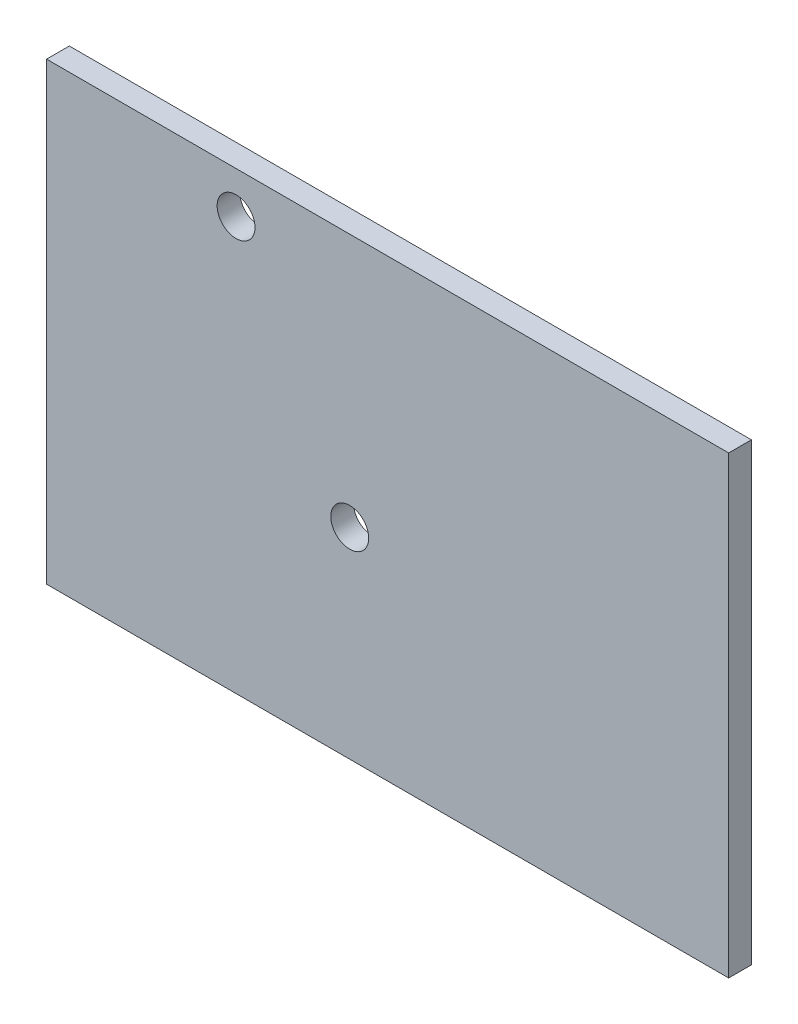
ISO-10303-21;
HEADER;
FILE_DESCRIPTION(('STEP AP214'),'2;1');
FILE_NAME('part.step','',(''),(''),'','','');
FILE_SCHEMA(('AUTOMOTIVE_DESIGN { 1 0 10303 214 1 1 1 1 }'));
ENDSEC;
DATA;
#1=APPLICATION_CONTEXT('core data for automotive mechanical design processes');
#2=APPLICATION_PROTOCOL_DEFINITION('international standard','automotive_design',2000,#1);
#3=PRODUCT_CONTEXT('',#1,'mechanical');
#4=PRODUCT('Part','Part','',(#3));
#5=PRODUCT_RELATED_PRODUCT_CATEGORY('part','',(#4));
#6=PRODUCT_DEFINITION_FORMATION('','',#4);
#7=PRODUCT_DEFINITION_CONTEXT('part definition',#1,'design');
#8=PRODUCT_DEFINITION('design','',#6,#7);
#9=PRODUCT_DEFINITION_SHAPE('','',#8);
#10=(LENGTH_UNIT() NAMED_UNIT(*) SI_UNIT(.MILLI.,.METRE.));
#11=(NAMED_UNIT(*) PLANE_ANGLE_UNIT() SI_UNIT($,.RADIAN.));
#12=(NAMED_UNIT(*) SI_UNIT($,.STERADIAN.) SOLID_ANGLE_UNIT());
#13=UNCERTAINTY_MEASURE_WITH_UNIT(LENGTH_MEASURE(1.E-05),#10,'distance_accuracy_value','');
#14=(GEOMETRIC_REPRESENTATION_CONTEXT(3) GLOBAL_UNCERTAINTY_ASSIGNED_CONTEXT((#13)) GLOBAL_UNIT_ASSIGNED_CONTEXT((#10,
#11,#12)) REPRESENTATION_CONTEXT('',''));
#15=CARTESIAN_POINT('',(0.,0.,0.));
#16=DIRECTION('',(0.,0.,1.));
#17=DIRECTION('',(1.,0.,0.));
#18=AXIS2_PLACEMENT_3D('',#15,#16,#17);
#19=CARTESIAN_POINT('',(0.,0.,3.));
#20=DIRECTION('',(0.,0.,1.));
#21=DIRECTION('',(1.,0.,0.));
#22=AXIS2_PLACEMENT_3D('',#19,#20,#21);
#23=PLANE('',#22);
#24=CARTESIAN_POINT('',(-20.,24.5,3.));
#25=DIRECTION('',(0.,0.,1.));
#26=DIRECTION('',(1.,0.,0.));
#27=AXIS2_PLACEMENT_3D('',#24,#25,#26);
#28=CIRCLE('',#27,2.5);
#29=CARTESIAN_POINT('',(-17.5,24.5,3.));
#30=VERTEX_POINT('',#29);
#31=EDGE_CURVE('E100',#30,#30,#28,.T.);
#32=ORIENTED_EDGE('',*,*,#31,.F.);
#33=EDGE_LOOP('',(#32));
#34=FACE_BOUND('',#33,.T.);
#35=DIRECTION('',(0.,1.,0.));
#36=VECTOR('',#35,1.);
#37=CARTESIAN_POINT('',(45.,30.,3.));
#38=LINE('',#37,#36);
#39=CARTESIAN_POINT('',(45.,-30.,3.));
#40=VERTEX_POINT('',#39);
#41=CARTESIAN_POINT('',(45.,30.,3.));
#42=VERTEX_POINT('',#41);
#43=EDGE_CURVE('E85',#40,#42,#38,.T.);
#44=ORIENTED_EDGE('',*,*,#43,.T.);
#45=DIRECTION('',(-1.,0.,0.));
#46=VECTOR('',#45,1.);
#47=CARTESIAN_POINT('',(-45.,30.,3.));
#48=LINE('',#47,#46);
#49=CARTESIAN_POINT('',(-45.,30.,3.));
#50=VERTEX_POINT('',#49);
#51=EDGE_CURVE('E80',#42,#50,#48,.T.);
#52=ORIENTED_EDGE('',*,*,#51,.T.);
#53=DIRECTION('',(0.,-1.,0.));
#54=VECTOR('',#53,1.);
#55=CARTESIAN_POINT('',(-45.,30.,3.));
#56=LINE('',#55,#54);
#57=CARTESIAN_POINT('',(-45.,-30.,3.));
#58=VERTEX_POINT('',#57);
#59=EDGE_CURVE('E83',#50,#58,#56,.T.);
#60=ORIENTED_EDGE('',*,*,#59,.T.);
#61=DIRECTION('',(1.,0.,0.));
#62=VECTOR('',#61,1.);
#63=CARTESIAN_POINT('',(-45.,-30.,3.));
#64=LINE('',#63,#62);
#65=EDGE_CURVE('E50',#58,#40,#64,.T.);
#66=ORIENTED_EDGE('',*,*,#65,.T.);
#67=EDGE_LOOP('',(#44,#52,#60,#66));
#68=FACE_BOUND('',#67,.T.);
#69=CARTESIAN_POINT('',(-5.,-3.50000000000001,3.));
#70=DIRECTION('',(0.,0.,1.));
#71=DIRECTION('',(1.,0.,0.));
#72=AXIS2_PLACEMENT_3D('',#69,#70,#71);
#73=CIRCLE('',#72,2.5);
#74=CARTESIAN_POINT('',(-2.5,-3.50000000000001,3.));
#75=VERTEX_POINT('',#74);
#76=EDGE_CURVE('E115',#75,#75,#73,.T.);
#77=ORIENTED_EDGE('',*,*,#76,.F.);
#78=EDGE_LOOP('',(#77));
#79=FACE_BOUND('',#78,.T.);
#80=ADVANCED_FACE('F33',(#34,#68,#79),#23,.T.);
#81=CARTESIAN_POINT('',(0.,0.,0.));
#82=DIRECTION('',(0.,0.,1.));
#83=DIRECTION('',(1.,0.,0.));
#84=AXIS2_PLACEMENT_3D('',#81,#82,#83);
#85=PLANE('',#84);
#86=DIRECTION('',(0.,1.,0.));
#87=VECTOR('',#86,1.);
#88=CARTESIAN_POINT('',(45.,30.,0.));
#89=LINE('',#88,#87);
#90=CARTESIAN_POINT('',(45.,-30.,0.));
#91=VERTEX_POINT('',#90);
#92=CARTESIAN_POINT('',(45.,30.,0.));
#93=VERTEX_POINT('',#92);
#94=EDGE_CURVE('E97',#91,#93,#89,.T.);
#95=ORIENTED_EDGE('',*,*,#94,.F.);
#96=DIRECTION('',(1.,0.,0.));
#97=VECTOR('',#96,1.);
#98=CARTESIAN_POINT('',(-45.,-30.,0.));
#99=LINE('',#98,#97);
#100=CARTESIAN_POINT('',(-45.,-30.,0.));
#101=VERTEX_POINT('',#100);
#102=EDGE_CURVE('E73',#101,#91,#99,.T.);
#103=ORIENTED_EDGE('',*,*,#102,.F.);
#104=DIRECTION('',(0.,-1.,0.));
#105=VECTOR('',#104,1.);
#106=CARTESIAN_POINT('',(-45.,30.,0.));
#107=LINE('',#106,#105);
#108=CARTESIAN_POINT('',(-45.,30.,0.));
#109=VERTEX_POINT('',#108);
#110=EDGE_CURVE('E67',#109,#101,#107,.T.);
#111=ORIENTED_EDGE('',*,*,#110,.F.);
#112=DIRECTION('',(-1.,0.,0.));
#113=VECTOR('',#112,1.);
#114=CARTESIAN_POINT('',(-45.,30.,0.));
#115=LINE('',#114,#113);
#116=EDGE_CURVE('E89',#93,#109,#115,.T.);
#117=ORIENTED_EDGE('',*,*,#116,.F.);
#118=EDGE_LOOP('',(#95,#103,#111,#117));
#119=FACE_BOUND('',#118,.T.);
#120=CARTESIAN_POINT('',(-20.,24.5,0.));
#121=DIRECTION('',(0.,0.,1.));
#122=DIRECTION('',(1.,0.,0.));
#123=AXIS2_PLACEMENT_3D('',#120,#121,#122);
#124=CIRCLE('',#123,2.5);
#125=CARTESIAN_POINT('',(-17.5,24.5,0.));
#126=VERTEX_POINT('',#125);
#127=EDGE_CURVE('E112',#126,#126,#124,.T.);
#128=ORIENTED_EDGE('',*,*,#127,.T.);
#129=EDGE_LOOP('',(#128));
#130=FACE_BOUND('',#129,.T.);
#131=CARTESIAN_POINT('',(-5.,-3.50000000000001,0.));
#132=DIRECTION('',(0.,0.,1.));
#133=DIRECTION('',(1.,0.,0.));
#134=AXIS2_PLACEMENT_3D('',#131,#132,#133);
#135=CIRCLE('',#134,2.5);
#136=CARTESIAN_POINT('',(-2.5,-3.50000000000001,0.));
#137=VERTEX_POINT('',#136);
#138=EDGE_CURVE('E118',#137,#137,#135,.T.);
#139=ORIENTED_EDGE('',*,*,#138,.T.);
#140=EDGE_LOOP('',(#139));
#141=FACE_BOUND('',#140,.T.);
#142=ADVANCED_FACE('F108',(#119,#130,#141),#85,.F.);
#143=CARTESIAN_POINT('',(45.,30.,3.));
#144=DIRECTION('',(-1.,0.,0.));
#145=DIRECTION('',(0.,0.,1.));
#146=AXIS2_PLACEMENT_3D('',#143,#144,#145);
#147=PLANE('',#146);
#148=ORIENTED_EDGE('',*,*,#94,.T.);
#149=DIRECTION('',(0.,0.,-1.));
#150=VECTOR('',#149,1.);
#151=CARTESIAN_POINT('',(45.,30.,3.));
#152=LINE('',#151,#150);
#153=EDGE_CURVE('E11',#42,#93,#152,.T.);
#154=ORIENTED_EDGE('',*,*,#153,.F.);
#155=ORIENTED_EDGE('',*,*,#43,.F.);
#156=DIRECTION('',(0.,0.,-1.));
#157=VECTOR('',#156,1.);
#158=CARTESIAN_POINT('',(45.,-30.,3.));
#159=LINE('',#158,#157);
#160=EDGE_CURVE('E93',#40,#91,#159,.T.);
#161=ORIENTED_EDGE('',*,*,#160,.T.);
#162=EDGE_LOOP('',(#148,#154,#155,#161));
#163=FACE_BOUND('',#162,.T.);
#164=ADVANCED_FACE('F35',(#163),#147,.F.);
#165=CARTESIAN_POINT('',(-45.,30.,3.));
#166=DIRECTION('',(0.,-1.,0.));
#167=DIRECTION('',(0.,0.,-1.));
#168=AXIS2_PLACEMENT_3D('',#165,#166,#167);
#169=PLANE('',#168);
#170=ORIENTED_EDGE('',*,*,#116,.T.);
#171=DIRECTION('',(0.,0.,-1.));
#172=VECTOR('',#171,1.);
#173=CARTESIAN_POINT('',(-45.,30.,3.));
#174=LINE('',#173,#172);
#175=EDGE_CURVE('E42',#50,#109,#174,.T.);
#176=ORIENTED_EDGE('',*,*,#175,.F.);
#177=ORIENTED_EDGE('',*,*,#51,.F.);
#178=ORIENTED_EDGE('',*,*,#153,.T.);
#179=EDGE_LOOP('',(#170,#176,#177,#178));
#180=FACE_BOUND('',#179,.T.);
#181=ADVANCED_FACE('F88',(#180),#169,.F.);
#182=CARTESIAN_POINT('',(-45.,30.,3.));
#183=DIRECTION('',(1.,0.,0.));
#184=DIRECTION('',(0.,0.,-1.));
#185=AXIS2_PLACEMENT_3D('',#182,#183,#184);
#186=PLANE('',#185);
#187=ORIENTED_EDGE('',*,*,#110,.T.);
#188=DIRECTION('',(0.,0.,-1.));
#189=VECTOR('',#188,1.);
#190=CARTESIAN_POINT('',(-45.,-30.,3.));
#191=LINE('',#190,#189);
#192=EDGE_CURVE('E90',#58,#101,#191,.T.);
#193=ORIENTED_EDGE('',*,*,#192,.F.);
#194=ORIENTED_EDGE('',*,*,#59,.F.);
#195=ORIENTED_EDGE('',*,*,#175,.T.);
#196=EDGE_LOOP('',(#187,#193,#194,#195));
#197=FACE_BOUND('',#196,.T.);
#198=ADVANCED_FACE('F91',(#197),#186,.F.);
#199=CARTESIAN_POINT('',(-45.,-30.,3.));
#200=DIRECTION('',(0.,1.,0.));
#201=DIRECTION('',(0.,0.,1.));
#202=AXIS2_PLACEMENT_3D('',#199,#200,#201);
#203=PLANE('',#202);
#204=ORIENTED_EDGE('',*,*,#102,.T.);
#205=ORIENTED_EDGE('',*,*,#160,.F.);
#206=ORIENTED_EDGE('',*,*,#65,.F.);
#207=ORIENTED_EDGE('',*,*,#192,.T.);
#208=EDGE_LOOP('',(#204,#205,#206,#207));
#209=FACE_BOUND('',#208,.T.);
#210=ADVANCED_FACE('F105',(#209),#203,.F.);
#211=CARTESIAN_POINT('',(-20.,24.5,3.));
#212=DIRECTION('',(0.,0.,-1.));
#213=DIRECTION('',(-1.,0.,0.));
#214=AXIS2_PLACEMENT_3D('',#211,#212,#213);
#215=CYLINDRICAL_SURFACE('',#214,2.5);
#216=ORIENTED_EDGE('',*,*,#31,.T.);
#217=EDGE_LOOP('',(#216));
#218=FACE_BOUND('',#217,.T.);
#219=ORIENTED_EDGE('',*,*,#127,.F.);
#220=EDGE_LOOP('',(#219));
#221=FACE_BOUND('',#220,.T.);
#222=ADVANCED_FACE('F135',(#218,#221),#215,.F.);
#223=CARTESIAN_POINT('',(-5.,-3.50000000000001,3.));
#224=DIRECTION('',(0.,0.,-1.));
#225=DIRECTION('',(-1.,0.,0.));
#226=AXIS2_PLACEMENT_3D('',#223,#224,#225);
#227=CYLINDRICAL_SURFACE('',#226,2.5);
#228=ORIENTED_EDGE('',*,*,#76,.T.);
#229=EDGE_LOOP('',(#228));
#230=FACE_BOUND('',#229,.T.);
#231=ORIENTED_EDGE('',*,*,#138,.F.);
#232=EDGE_LOOP('',(#231));
#233=FACE_BOUND('',#232,.T.);
#234=ADVANCED_FACE('F124',(#230,#233),#227,.F.);
#235=CLOSED_SHELL('',(#80,#142,#164,#181,#198,#210,#222,#234));
#236=MANIFOLD_SOLID_BREP('B2',#235);
#237=ADVANCED_BREP_SHAPE_REPRESENTATION('',(#18,#236),#14);
#238=SHAPE_DEFINITION_REPRESENTATION(#9,#237);
ENDSEC;
END-ISO-10303-21;
